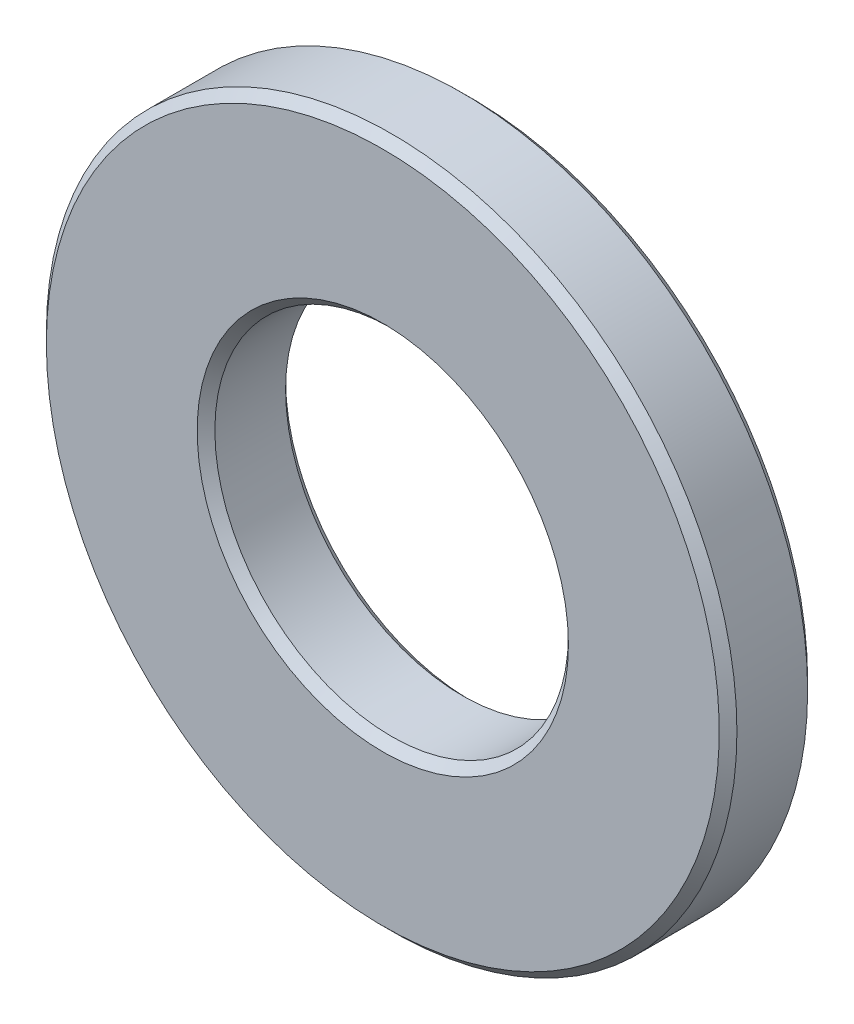
ISO-10303-21;
HEADER;
FILE_DESCRIPTION(('STEP AP214'),'2;1');
FILE_NAME('part.step','',(''),(''),'','','');
FILE_SCHEMA(('AUTOMOTIVE_DESIGN { 1 0 10303 214 1 1 1 1 }'));
ENDSEC;
DATA;
#1=APPLICATION_CONTEXT('core data for automotive mechanical design processes');
#2=APPLICATION_PROTOCOL_DEFINITION('international standard','automotive_design',2000,#1);
#3=PRODUCT_CONTEXT('',#1,'mechanical');
#4=PRODUCT('Part','Part','',(#3));
#5=PRODUCT_RELATED_PRODUCT_CATEGORY('part','',(#4));
#6=PRODUCT_DEFINITION_FORMATION('','',#4);
#7=PRODUCT_DEFINITION_CONTEXT('part definition',#1,'design');
#8=PRODUCT_DEFINITION('design','',#6,#7);
#9=PRODUCT_DEFINITION_SHAPE('','',#8);
#10=(LENGTH_UNIT() NAMED_UNIT(*) SI_UNIT(.MILLI.,.METRE.));
#11=(NAMED_UNIT(*) PLANE_ANGLE_UNIT() SI_UNIT($,.RADIAN.));
#12=(NAMED_UNIT(*) SI_UNIT($,.STERADIAN.) SOLID_ANGLE_UNIT());
#13=UNCERTAINTY_MEASURE_WITH_UNIT(LENGTH_MEASURE(1.E-05),#10,'distance_accuracy_value','');
#14=(GEOMETRIC_REPRESENTATION_CONTEXT(3) GLOBAL_UNCERTAINTY_ASSIGNED_CONTEXT((#13)) GLOBAL_UNIT_ASSIGNED_CONTEXT((#10,
#11,#12)) REPRESENTATION_CONTEXT('',''));
#15=CARTESIAN_POINT('',(0.,0.,0.));
#16=DIRECTION('',(0.,0.,1.));
#17=DIRECTION('',(1.,0.,0.));
#18=AXIS2_PLACEMENT_3D('',#15,#16,#17);
#19=CARTESIAN_POINT('',(0.,0.,-1.6));
#20=DIRECTION('',(0.,0.,-1.));
#21=DIRECTION('',(-1.,0.,0.));
#22=AXIS2_PLACEMENT_3D('',#19,#20,#21);
#23=PLANE('',#22);
#24=CARTESIAN_POINT('',(0.,0.,-1.59999999993943));
#25=DIRECTION('',(0.,0.,1.));
#26=DIRECTION('',(1.,0.,0.));
#27=AXIS2_PLACEMENT_3D('',#24,#25,#26);
#28=CIRCLE('',#27,6.08999999997195);
#29=CARTESIAN_POINT('',(6.08999999997195,0.,-1.59999999993943));
#30=VERTEX_POINT('',#29);
#31=EDGE_CURVE('E35',#30,#30,#28,.T.);
#32=ORIENTED_EDGE('',*,*,#31,.F.);
#33=EDGE_LOOP('',(#32));
#34=FACE_BOUND('',#33,.T.);
#35=CARTESIAN_POINT('',(0.,0.,-1.59999999999627));
#36=DIRECTION('',(0.,0.,-1.));
#37=DIRECTION('',(-1.,0.,0.));
#38=AXIS2_PLACEMENT_3D('',#35,#36,#37);
#39=CIRCLE('',#38,3.35999999998648);
#40=CARTESIAN_POINT('',(-3.35999999998648,0.,-1.59999999999627));
#41=VERTEX_POINT('',#40);
#42=EDGE_CURVE('E17',#41,#41,#39,.F.);
#43=ORIENTED_EDGE('',*,*,#42,.T.);
#44=EDGE_LOOP('',(#43));
#45=FACE_BOUND('',#44,.T.);
#46=ADVANCED_FACE('F14',(#34,#45),#23,.T.);
#47=CARTESIAN_POINT('',(0.,0.,-1.59999999988258));
#48=DIRECTION('',(0.,0.,-1.));
#49=DIRECTION('',(-1.,0.,0.));
#50=AXIS2_PLACEMENT_3D('',#47,#48,#49);
#51=CONICAL_SURFACE('',#50,3.3599999998728,0.785398163397448);
#52=CARTESIAN_POINT('',(0.,0.,-1.44));
#53=DIRECTION('',(0.,0.,-1.));
#54=DIRECTION('',(-1.,0.,0.));
#55=AXIS2_PLACEMENT_3D('',#52,#53,#54);
#56=CIRCLE('',#55,3.2);
#57=CARTESIAN_POINT('',(-3.2,0.,-1.44));
#58=VERTEX_POINT('',#57);
#59=EDGE_CURVE('E33',#58,#58,#56,.F.);
#60=ORIENTED_EDGE('',*,*,#59,.T.);
#61=EDGE_LOOP('',(#60));
#62=FACE_BOUND('',#61,.T.);
#63=ORIENTED_EDGE('',*,*,#42,.F.);
#64=EDGE_LOOP('',(#63));
#65=FACE_BOUND('',#64,.T.);
#66=ADVANCED_FACE('F48',(#62,#65),#51,.F.);
#67=CARTESIAN_POINT('',(0.,0.,-1.43999999994548));
#68=DIRECTION('',(0.,0.,1.));
#69=DIRECTION('',(1.,0.,0.));
#70=AXIS2_PLACEMENT_3D('',#67,#68,#69);
#71=CONICAL_SURFACE('',#70,6.25000000002274,0.785398163575084);
#72=CARTESIAN_POINT('',(0.,0.,-1.44));
#73=DIRECTION('',(0.,0.,-1.));
#74=DIRECTION('',(-1.,0.,0.));
#75=AXIS2_PLACEMENT_3D('',#72,#73,#74);
#76=CIRCLE('',#75,6.25);
#77=CARTESIAN_POINT('',(-6.25,0.,-1.44));
#78=VERTEX_POINT('',#77);
#79=EDGE_CURVE('E42',#78,#78,#76,.F.);
#80=ORIENTED_EDGE('',*,*,#79,.F.);
#81=EDGE_LOOP('',(#80));
#82=FACE_BOUND('',#81,.T.);
#83=ORIENTED_EDGE('',*,*,#31,.T.);
#84=EDGE_LOOP('',(#83));
#85=FACE_BOUND('',#84,.T.);
#86=ADVANCED_FACE('F50',(#82,#85),#71,.T.);
#87=CARTESIAN_POINT('',(0.,0.,0.));
#88=DIRECTION('',(0.,0.,-1.));
#89=DIRECTION('',(-1.,0.,0.));
#90=AXIS2_PLACEMENT_3D('',#87,#88,#89);
#91=CYLINDRICAL_SURFACE('',#90,3.2);
#92=CARTESIAN_POINT('',(0.,0.,-0.160000000050786));
#93=DIRECTION('',(0.,0.,1.));
#94=DIRECTION('',(1.,0.,0.));
#95=AXIS2_PLACEMENT_3D('',#92,#93,#94);
#96=CIRCLE('',#95,3.1999999999357);
#97=CARTESIAN_POINT('',(3.1999999999357,0.,-0.160000000050786));
#98=VERTEX_POINT('',#97);
#99=EDGE_CURVE('E85',#98,#98,#96,.T.);
#100=ORIENTED_EDGE('',*,*,#99,.T.);
#101=EDGE_LOOP('',(#100));
#102=FACE_BOUND('',#101,.T.);
#103=ORIENTED_EDGE('',*,*,#59,.F.);
#104=EDGE_LOOP('',(#103));
#105=FACE_BOUND('',#104,.T.);
#106=ADVANCED_FACE('F56',(#102,#105),#91,.F.);
#107=CARTESIAN_POINT('',(0.,0.,0.));
#108=DIRECTION('',(0.,0.,-1.));
#109=DIRECTION('',(-1.,0.,0.));
#110=AXIS2_PLACEMENT_3D('',#107,#108,#109);
#111=CYLINDRICAL_SURFACE('',#110,6.25);
#112=CARTESIAN_POINT('',(0.,0.,-0.160000000050786));
#113=DIRECTION('',(0.,0.,-1.));
#114=DIRECTION('',(-1.,0.,0.));
#115=AXIS2_PLACEMENT_3D('',#112,#113,#114);
#116=CIRCLE('',#115,6.25000000002274);
#117=CARTESIAN_POINT('',(-6.25000000002274,0.,-0.160000000050786));
#118=VERTEX_POINT('',#117);
#119=EDGE_CURVE('E30',#118,#118,#116,.F.);
#120=ORIENTED_EDGE('',*,*,#119,.F.);
#121=EDGE_LOOP('',(#120));
#122=FACE_BOUND('',#121,.T.);
#123=ORIENTED_EDGE('',*,*,#79,.T.);
#124=EDGE_LOOP('',(#123));
#125=FACE_BOUND('',#124,.T.);
#126=ADVANCED_FACE('F74',(#122,#125),#111,.T.);
#127=CARTESIAN_POINT('',(0.,0.,-1.13686837721616E-10));
#128=DIRECTION('',(0.,0.,1.));
#129=DIRECTION('',(1.,0.,0.));
#130=AXIS2_PLACEMENT_3D('',#127,#128,#129);
#131=CONICAL_SURFACE('',#130,3.3599999998728,0.785398163397448);
#132=ORIENTED_EDGE('',*,*,#99,.F.);
#133=EDGE_LOOP('',(#132));
#134=FACE_BOUND('',#133,.T.);
#135=CARTESIAN_POINT('',(0.,0.,0.));
#136=DIRECTION('',(0.,0.,1.));
#137=DIRECTION('',(1.,0.,0.));
#138=AXIS2_PLACEMENT_3D('',#135,#136,#137);
#139=CIRCLE('',#138,3.35999999998648);
#140=CARTESIAN_POINT('',(3.35999999998648,0.,0.));
#141=VERTEX_POINT('',#140);
#142=EDGE_CURVE('E22',#141,#141,#139,.T.);
#143=ORIENTED_EDGE('',*,*,#142,.T.);
#144=EDGE_LOOP('',(#143));
#145=FACE_BOUND('',#144,.T.);
#146=ADVANCED_FACE('F67',(#134,#145),#131,.F.);
#147=CARTESIAN_POINT('',(0.,0.,-0.160000000050786));
#148=DIRECTION('',(0.,0.,-1.));
#149=DIRECTION('',(-1.,0.,0.));
#150=AXIS2_PLACEMENT_3D('',#147,#148,#149);
#151=CONICAL_SURFACE('',#150,6.25000000002274,0.785398163575084);
#152=ORIENTED_EDGE('',*,*,#119,.T.);
#153=EDGE_LOOP('',(#152));
#154=FACE_BOUND('',#153,.T.);
#155=CARTESIAN_POINT('',(0.,0.,-5.68433917557537E-11));
#156=DIRECTION('',(0.,0.,-1.));
#157=DIRECTION('',(-1.,0.,0.));
#158=AXIS2_PLACEMENT_3D('',#155,#156,#157);
#159=CIRCLE('',#158,6.08999999997195);
#160=CARTESIAN_POINT('',(-6.08999999997195,0.,-5.68433917557537E-11));
#161=VERTEX_POINT('',#160);
#162=EDGE_CURVE('E10',#161,#161,#159,.T.);
#163=ORIENTED_EDGE('',*,*,#162,.T.);
#164=EDGE_LOOP('',(#163));
#165=FACE_BOUND('',#164,.T.);
#166=ADVANCED_FACE('F62',(#154,#165),#151,.T.);
#167=CARTESIAN_POINT('',(0.,0.,0.));
#168=DIRECTION('',(0.,0.,-1.));
#169=DIRECTION('',(-1.,0.,0.));
#170=AXIS2_PLACEMENT_3D('',#167,#168,#169);
#171=PLANE('',#170);
#172=ORIENTED_EDGE('',*,*,#162,.F.);
#173=EDGE_LOOP('',(#172));
#174=FACE_BOUND('',#173,.T.);
#175=ORIENTED_EDGE('',*,*,#142,.F.);
#176=EDGE_LOOP('',(#175));
#177=FACE_BOUND('',#176,.T.);
#178=ADVANCED_FACE('F60',(#174,#177),#171,.F.);
#179=CLOSED_SHELL('',(#46,#66,#86,#106,#126,#146,#166,#178));
#180=MANIFOLD_SOLID_BREP('B1',#179);
#181=ADVANCED_BREP_SHAPE_REPRESENTATION('',(#18,#180),#14);
#182=SHAPE_DEFINITION_REPRESENTATION(#9,#181);
ENDSEC;
END-ISO-10303-21;
